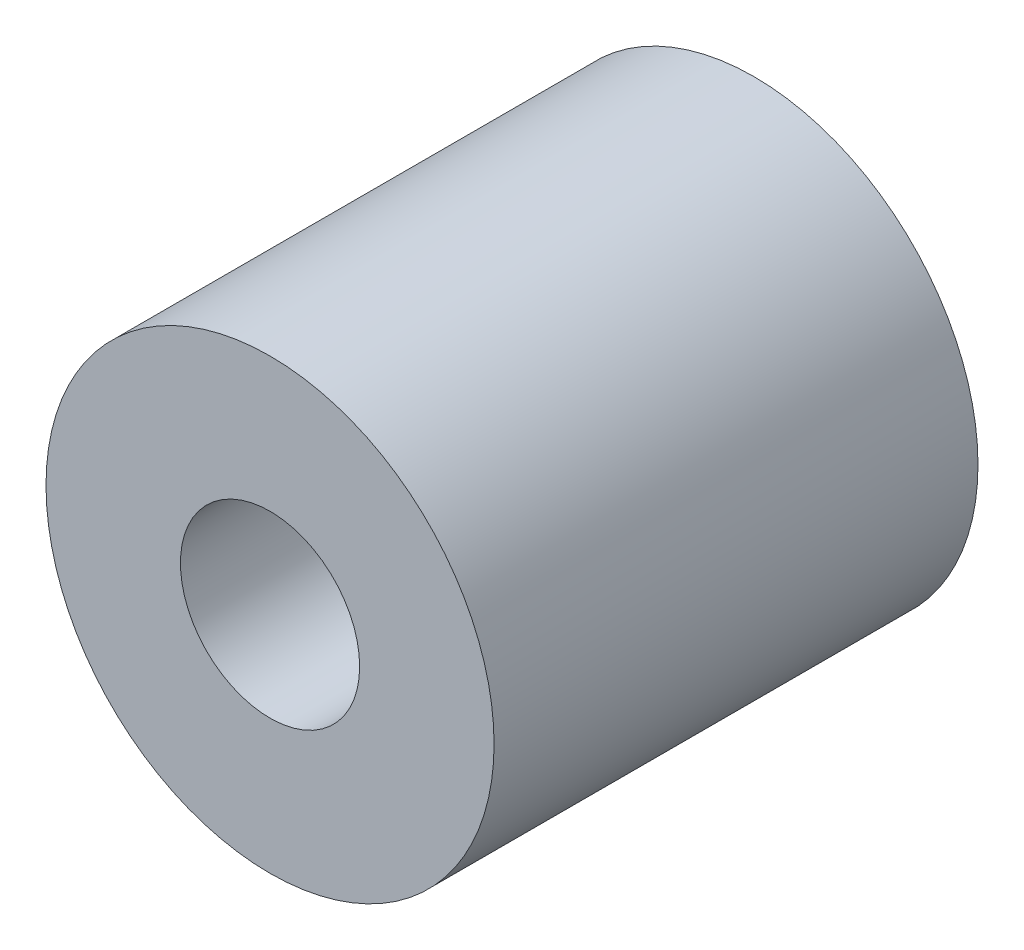
ISO-10303-21;
HEADER;
FILE_DESCRIPTION(('STEP AP214'),'2;1');
FILE_NAME('part.step','',(''),(''),'','','');
FILE_SCHEMA(('AUTOMOTIVE_DESIGN { 1 0 10303 214 1 1 1 1 }'));
ENDSEC;
DATA;
#1=APPLICATION_CONTEXT('core data for automotive mechanical design processes');
#2=APPLICATION_PROTOCOL_DEFINITION('international standard','automotive_design',2000,#1);
#3=PRODUCT_CONTEXT('',#1,'mechanical');
#4=PRODUCT('Part','Part','',(#3));
#5=PRODUCT_RELATED_PRODUCT_CATEGORY('part','',(#4));
#6=PRODUCT_DEFINITION_FORMATION('','',#4);
#7=PRODUCT_DEFINITION_CONTEXT('part definition',#1,'design');
#8=PRODUCT_DEFINITION('design','',#6,#7);
#9=PRODUCT_DEFINITION_SHAPE('','',#8);
#10=(LENGTH_UNIT() NAMED_UNIT(*) SI_UNIT(.MILLI.,.METRE.));
#11=(NAMED_UNIT(*) PLANE_ANGLE_UNIT() SI_UNIT($,.RADIAN.));
#12=(NAMED_UNIT(*) SI_UNIT($,.STERADIAN.) SOLID_ANGLE_UNIT());
#13=UNCERTAINTY_MEASURE_WITH_UNIT(LENGTH_MEASURE(1.E-05),#10,'distance_accuracy_value','');
#14=(GEOMETRIC_REPRESENTATION_CONTEXT(3) GLOBAL_UNCERTAINTY_ASSIGNED_CONTEXT((#13)) GLOBAL_UNIT_ASSIGNED_CONTEXT((#10,
#11,#12)) REPRESENTATION_CONTEXT('',''));
#15=CARTESIAN_POINT('',(0.,0.,0.));
#16=DIRECTION('',(0.,0.,1.));
#17=DIRECTION('',(1.,0.,0.));
#18=AXIS2_PLACEMENT_3D('',#15,#16,#17);
#19=CARTESIAN_POINT('',(0.,0.,6.858));
#20=DIRECTION('',(0.,0.,1.));
#21=DIRECTION('',(1.,0.,0.));
#22=AXIS2_PLACEMENT_3D('',#19,#20,#21);
#23=PLANE('',#22);
#24=CARTESIAN_POINT('',(0.,0.,6.858));
#25=DIRECTION('',(0.,0.,1.));
#26=DIRECTION('',(1.,0.,0.));
#27=AXIS2_PLACEMENT_3D('',#24,#25,#26);
#28=CIRCLE('',#27,3.175);
#29=CARTESIAN_POINT('',(3.175,0.,6.858));
#30=VERTEX_POINT('',#29);
#31=EDGE_CURVE('E10',#30,#30,#28,.T.);
#32=ORIENTED_EDGE('',*,*,#31,.T.);
#33=EDGE_LOOP('',(#32));
#34=FACE_BOUND('',#33,.T.);
#35=CARTESIAN_POINT('',(0.,0.,6.858));
#36=DIRECTION('',(0.,0.,1.));
#37=DIRECTION('',(1.,0.,0.));
#38=AXIS2_PLACEMENT_3D('',#35,#36,#37);
#39=CIRCLE('',#38,1.27);
#40=CARTESIAN_POINT('',(1.27,0.,6.858));
#41=VERTEX_POINT('',#40);
#42=EDGE_CURVE('E43',#41,#41,#39,.T.);
#43=ORIENTED_EDGE('',*,*,#42,.F.);
#44=EDGE_LOOP('',(#43));
#45=FACE_BOUND('',#44,.T.);
#46=ADVANCED_FACE('F32',(#34,#45),#23,.T.);
#47=CARTESIAN_POINT('',(0.,0.,0.));
#48=DIRECTION('',(0.,0.,1.));
#49=DIRECTION('',(1.,0.,0.));
#50=AXIS2_PLACEMENT_3D('',#47,#48,#49);
#51=PLANE('',#50);
#52=CARTESIAN_POINT('',(0.,0.,0.));
#53=DIRECTION('',(0.,0.,1.));
#54=DIRECTION('',(1.,0.,0.));
#55=AXIS2_PLACEMENT_3D('',#52,#53,#54);
#56=CIRCLE('',#55,3.175);
#57=CARTESIAN_POINT('',(3.175,0.,0.));
#58=VERTEX_POINT('',#57);
#59=EDGE_CURVE('E36',#58,#58,#56,.T.);
#60=ORIENTED_EDGE('',*,*,#59,.F.);
#61=EDGE_LOOP('',(#60));
#62=FACE_BOUND('',#61,.T.);
#63=CARTESIAN_POINT('',(0.,0.,0.));
#64=DIRECTION('',(0.,0.,1.));
#65=DIRECTION('',(1.,0.,0.));
#66=AXIS2_PLACEMENT_3D('',#63,#64,#65);
#67=CIRCLE('',#66,1.27);
#68=CARTESIAN_POINT('',(1.27,0.,0.));
#69=VERTEX_POINT('',#68);
#70=EDGE_CURVE('E45',#69,#69,#67,.T.);
#71=ORIENTED_EDGE('',*,*,#70,.T.);
#72=EDGE_LOOP('',(#71));
#73=FACE_BOUND('',#72,.T.);
#74=ADVANCED_FACE('F55',(#62,#73),#51,.F.);
#75=CARTESIAN_POINT('',(0.,0.,6.858));
#76=DIRECTION('',(0.,0.,-1.));
#77=DIRECTION('',(-1.,0.,0.));
#78=AXIS2_PLACEMENT_3D('',#75,#76,#77);
#79=CYLINDRICAL_SURFACE('',#78,3.175);
#80=ORIENTED_EDGE('',*,*,#31,.F.);
#81=EDGE_LOOP('',(#80));
#82=FACE_BOUND('',#81,.T.);
#83=ORIENTED_EDGE('',*,*,#59,.T.);
#84=EDGE_LOOP('',(#83));
#85=FACE_BOUND('',#84,.T.);
#86=ADVANCED_FACE('F34',(#82,#85),#79,.T.);
#87=CARTESIAN_POINT('',(0.,0.,6.858));
#88=DIRECTION('',(0.,0.,-1.));
#89=DIRECTION('',(-1.,0.,0.));
#90=AXIS2_PLACEMENT_3D('',#87,#88,#89);
#91=CYLINDRICAL_SURFACE('',#90,1.27);
#92=ORIENTED_EDGE('',*,*,#42,.T.);
#93=EDGE_LOOP('',(#92));
#94=FACE_BOUND('',#93,.T.);
#95=ORIENTED_EDGE('',*,*,#70,.F.);
#96=EDGE_LOOP('',(#95));
#97=FACE_BOUND('',#96,.T.);
#98=ADVANCED_FACE('F51',(#94,#97),#91,.F.);
#99=CLOSED_SHELL('',(#46,#74,#86,#98));
#100=MANIFOLD_SOLID_BREP('B2',#99);
#101=ADVANCED_BREP_SHAPE_REPRESENTATION('',(#18,#100),#14);
#102=SHAPE_DEFINITION_REPRESENTATION(#9,#101);
ENDSEC;
END-ISO-10303-21;
